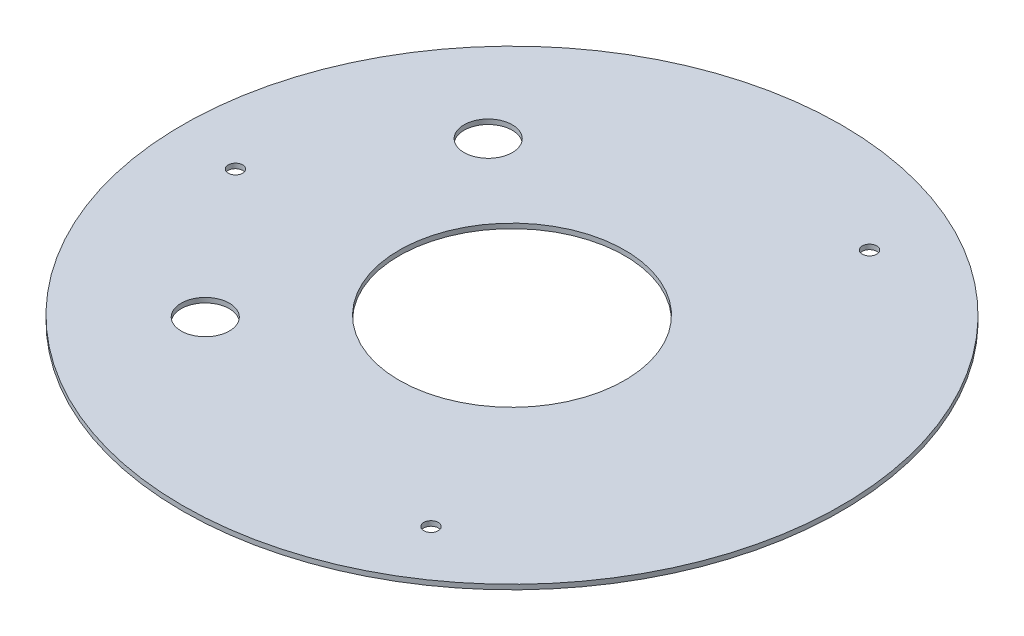
ISO-10303-21;
HEADER;
FILE_DESCRIPTION(('STEP AP214'),'2;1');
FILE_NAME('part.step','',(''),(''),'','','');
FILE_SCHEMA(('AUTOMOTIVE_DESIGN { 1 0 10303 214 1 1 1 1 }'));
ENDSEC;
DATA;
#1=APPLICATION_CONTEXT('core data for automotive mechanical design processes');
#2=APPLICATION_PROTOCOL_DEFINITION('international standard','automotive_design',2000,#1);
#3=PRODUCT_CONTEXT('',#1,'mechanical');
#4=PRODUCT('Part','Part','',(#3));
#5=PRODUCT_RELATED_PRODUCT_CATEGORY('part','',(#4));
#6=PRODUCT_DEFINITION_FORMATION('','',#4);
#7=PRODUCT_DEFINITION_CONTEXT('part definition',#1,'design');
#8=PRODUCT_DEFINITION('design','',#6,#7);
#9=PRODUCT_DEFINITION_SHAPE('','',#8);
#10=(LENGTH_UNIT() NAMED_UNIT(*) SI_UNIT(.MILLI.,.METRE.));
#11=(NAMED_UNIT(*) PLANE_ANGLE_UNIT() SI_UNIT($,.RADIAN.));
#12=(NAMED_UNIT(*) SI_UNIT($,.STERADIAN.) SOLID_ANGLE_UNIT());
#13=UNCERTAINTY_MEASURE_WITH_UNIT(LENGTH_MEASURE(1.E-05),#10,'distance_accuracy_value','');
#14=(GEOMETRIC_REPRESENTATION_CONTEXT(3) GLOBAL_UNCERTAINTY_ASSIGNED_CONTEXT((#13)) GLOBAL_UNIT_ASSIGNED_CONTEXT((#10,
#11,#12)) REPRESENTATION_CONTEXT('',''));
#15=CARTESIAN_POINT('',(0.,0.,0.));
#16=DIRECTION('',(0.,0.,1.));
#17=DIRECTION('',(1.,0.,0.));
#18=AXIS2_PLACEMENT_3D('',#15,#16,#17);
#19=CARTESIAN_POINT('',(73.2496011945377,1.,33.2166503223373));
#20=DIRECTION('',(0.,1.,0.));
#21=DIRECTION('',(0.,0.,1.));
#22=AXIS2_PLACEMENT_3D('',#19,#20,#21);
#23=PLANE('',#22);
#24=CARTESIAN_POINT('',(41.7658419540778,1.,65.3689893366105));
#25=DIRECTION('',(0.,1.,0.));
#26=DIRECTION('',(0.,0.,1.));
#27=AXIS2_PLACEMENT_3D('',#24,#25,#26);
#28=CIRCLE('',#27,5.);
#29=CARTESIAN_POINT('',(41.7658419540778,1.,70.3689893366105));
#30=VERTEX_POINT('',#29);
#31=EDGE_CURVE('E66',#30,#30,#28,.T.);
#32=ORIENTED_EDGE('',*,*,#31,.F.);
#33=EDGE_LOOP('',(#32));
#34=FACE_BOUND('',#33,.T.);
#35=CARTESIAN_POINT('',(39.056391221283,1.,3.96217388325344));
#36=DIRECTION('',(0.,1.,0.));
#37=DIRECTION('',(0.,0.,1.));
#38=AXIS2_PLACEMENT_3D('',#35,#36,#37);
#39=CIRCLE('',#38,5.);
#40=CARTESIAN_POINT('',(39.056391221283,1.,8.96217388325344));
#41=VERTEX_POINT('',#40);
#42=EDGE_CURVE('E65',#41,#41,#39,.T.);
#43=ORIENTED_EDGE('',*,*,#42,.F.);
#44=EDGE_LOOP('',(#43));
#45=FACE_BOUND('',#44,.T.);
#46=CARTESIAN_POINT('',(102.822466875922,1.,79.5895477451951));
#47=DIRECTION('',(0.,-1.,0.));
#48=DIRECTION('',(0.,0.,-1.));
#49=AXIS2_PLACEMENT_3D('',#46,#47,#48);
#50=CIRCLE('',#49,1.50000000000001);
#51=CARTESIAN_POINT('',(102.822466875922,1.,78.0895477451951));
#52=VERTEX_POINT('',#51);
#53=EDGE_CURVE('E59',#52,#52,#50,.T.);
#54=ORIENTED_EDGE('',*,*,#53,.T.);
#55=EDGE_LOOP('',(#54));
#56=FACE_BOUND('',#55,.T.);
#57=CARTESIAN_POINT('',(73.2496011945377,1.,33.2166503223373));
#58=DIRECTION('',(0.,1.,0.));
#59=DIRECTION('',(0.,0.,1.));
#60=AXIS2_PLACEMENT_3D('',#57,#58,#59);
#61=CIRCLE('',#60,23.4009999999999);
#62=CARTESIAN_POINT('',(73.2496011945377,1.,56.6176503223373));
#63=VERTEX_POINT('',#62);
#64=EDGE_CURVE('E46',#63,#63,#61,.T.);
#65=ORIENTED_EDGE('',*,*,#64,.F.);
#66=EDGE_LOOP('',(#65));
#67=FACE_BOUND('',#66,.T.);
#68=CARTESIAN_POINT('',(73.2496011945377,1.,33.2166503223373));
#69=DIRECTION('',(0.,1.,0.));
#70=DIRECTION('',(0.,0.,1.));
#71=AXIS2_PLACEMENT_3D('',#68,#69,#70);
#72=CIRCLE('',#71,68.3699999983781);
#73=CARTESIAN_POINT('',(73.2496011945377,1.,101.586650320715));
#74=VERTEX_POINT('',#73);
#75=EDGE_CURVE('E10',#74,#74,#72,.T.);
#76=ORIENTED_EDGE('',*,*,#75,.T.);
#77=EDGE_LOOP('',(#76));
#78=FACE_BOUND('',#77,.T.);
#79=CARTESIAN_POINT('',(18.3030611385606,1.,35.6410545536932));
#80=DIRECTION('',(0.,-1.,0.));
#81=DIRECTION('',(0.,0.,-1.));
#82=AXIS2_PLACEMENT_3D('',#79,#80,#81);
#83=CIRCLE('',#82,1.50000000000001);
#84=CARTESIAN_POINT('',(18.3030611385606,1.,34.1410545536932));
#85=VERTEX_POINT('',#84);
#86=EDGE_CURVE('E55',#85,#85,#83,.T.);
#87=ORIENTED_EDGE('',*,*,#86,.T.);
#88=EDGE_LOOP('',(#87));
#89=FACE_BOUND('',#88,.T.);
#90=CARTESIAN_POINT('',(98.6232755691298,1.,-15.5806513318759));
#91=DIRECTION('',(0.,-1.,0.));
#92=DIRECTION('',(0.,0.,-1.));
#93=AXIS2_PLACEMENT_3D('',#90,#91,#92);
#94=CIRCLE('',#93,1.5);
#95=CARTESIAN_POINT('',(98.6232755691298,1.,-17.0806513318759));
#96=VERTEX_POINT('',#95);
#97=EDGE_CURVE('E62',#96,#96,#94,.T.);
#98=ORIENTED_EDGE('',*,*,#97,.T.);
#99=EDGE_LOOP('',(#98));
#100=FACE_BOUND('',#99,.T.);
#101=ADVANCED_FACE('F33',(#34,#45,#56,#67,#78,#89,#100),#23,.T.);
#102=CARTESIAN_POINT('',(73.2496011945377,0.,33.2166503223373));
#103=DIRECTION('',(0.,1.,0.));
#104=DIRECTION('',(0.,0.,1.));
#105=AXIS2_PLACEMENT_3D('',#102,#103,#104);
#106=PLANE('',#105);
#107=CARTESIAN_POINT('',(41.7658419540778,0.,65.3689893366105));
#108=DIRECTION('',(0.,1.,0.));
#109=DIRECTION('',(0.,0.,1.));
#110=AXIS2_PLACEMENT_3D('',#107,#108,#109);
#111=CIRCLE('',#110,5.);
#112=CARTESIAN_POINT('',(41.7658419540778,0.,70.3689893366105));
#113=VERTEX_POINT('',#112);
#114=EDGE_CURVE('E37',#113,#113,#111,.T.);
#115=ORIENTED_EDGE('',*,*,#114,.T.);
#116=EDGE_LOOP('',(#115));
#117=FACE_BOUND('',#116,.T.);
#118=CARTESIAN_POINT('',(39.056391221283,0.,3.96217388325344));
#119=DIRECTION('',(0.,1.,0.));
#120=DIRECTION('',(0.,0.,1.));
#121=AXIS2_PLACEMENT_3D('',#118,#119,#120);
#122=CIRCLE('',#121,5.);
#123=CARTESIAN_POINT('',(39.056391221283,0.,8.96217388325344));
#124=VERTEX_POINT('',#123);
#125=EDGE_CURVE('E63',#124,#124,#122,.T.);
#126=ORIENTED_EDGE('',*,*,#125,.T.);
#127=EDGE_LOOP('',(#126));
#128=FACE_BOUND('',#127,.T.);
#129=CARTESIAN_POINT('',(102.822466875922,0.,79.5895477451951));
#130=DIRECTION('',(0.,1.,0.));
#131=DIRECTION('',(0.,0.,1.));
#132=AXIS2_PLACEMENT_3D('',#129,#130,#131);
#133=CIRCLE('',#132,1.50000000000001);
#134=CARTESIAN_POINT('',(102.822466875922,0.,81.0895477451951));
#135=VERTEX_POINT('',#134);
#136=EDGE_CURVE('E56',#135,#135,#133,.F.);
#137=ORIENTED_EDGE('',*,*,#136,.F.);
#138=EDGE_LOOP('',(#137));
#139=FACE_BOUND('',#138,.T.);
#140=CARTESIAN_POINT('',(73.2496011945377,0.,33.2166503223373));
#141=DIRECTION('',(0.,1.,0.));
#142=DIRECTION('',(0.,0.,1.));
#143=AXIS2_PLACEMENT_3D('',#140,#141,#142);
#144=CIRCLE('',#143,23.4009999999999);
#145=CARTESIAN_POINT('',(73.2496011945377,0.,56.6176503223373));
#146=VERTEX_POINT('',#145);
#147=EDGE_CURVE('E49',#146,#146,#144,.T.);
#148=ORIENTED_EDGE('',*,*,#147,.T.);
#149=EDGE_LOOP('',(#148));
#150=FACE_BOUND('',#149,.T.);
#151=CARTESIAN_POINT('',(73.2496011945377,0.,33.2166503223373));
#152=DIRECTION('',(0.,1.,0.));
#153=DIRECTION('',(0.,0.,1.));
#154=AXIS2_PLACEMENT_3D('',#151,#152,#153);
#155=CIRCLE('',#154,68.3699999983781);
#156=CARTESIAN_POINT('',(73.2496011945377,0.,101.586650320715));
#157=VERTEX_POINT('',#156);
#158=EDGE_CURVE('E41',#157,#157,#155,.T.);
#159=ORIENTED_EDGE('',*,*,#158,.F.);
#160=EDGE_LOOP('',(#159));
#161=FACE_BOUND('',#160,.T.);
#162=CARTESIAN_POINT('',(18.3030611385606,0.,35.6410545536932));
#163=DIRECTION('',(0.,1.,0.));
#164=DIRECTION('',(0.,0.,1.));
#165=AXIS2_PLACEMENT_3D('',#162,#163,#164);
#166=CIRCLE('',#165,1.50000000000001);
#167=CARTESIAN_POINT('',(18.3030611385606,0.,37.1410545536932));
#168=VERTEX_POINT('',#167);
#169=EDGE_CURVE('E52',#168,#168,#166,.F.);
#170=ORIENTED_EDGE('',*,*,#169,.F.);
#171=EDGE_LOOP('',(#170));
#172=FACE_BOUND('',#171,.T.);
#173=CARTESIAN_POINT('',(98.6232755691298,0.,-15.5806513318759));
#174=DIRECTION('',(0.,1.,0.));
#175=DIRECTION('',(0.,0.,1.));
#176=AXIS2_PLACEMENT_3D('',#173,#174,#175);
#177=CIRCLE('',#176,1.5);
#178=CARTESIAN_POINT('',(98.6232755691298,0.,-14.0806513318759));
#179=VERTEX_POINT('',#178);
#180=EDGE_CURVE('E60',#179,#179,#177,.F.);
#181=ORIENTED_EDGE('',*,*,#180,.F.);
#182=EDGE_LOOP('',(#181));
#183=FACE_BOUND('',#182,.T.);
#184=ADVANCED_FACE('F88',(#117,#128,#139,#150,#161,#172,#183),#106,.F.);
#185=CARTESIAN_POINT('',(73.2496011945377,1.,33.2166503223373));
#186=DIRECTION('',(0.,-1.,0.));
#187=DIRECTION('',(0.,0.,-1.));
#188=AXIS2_PLACEMENT_3D('',#185,#186,#187);
#189=CYLINDRICAL_SURFACE('',#188,68.3699999983781);
#190=ORIENTED_EDGE('',*,*,#75,.F.);
#191=EDGE_LOOP('',(#190));
#192=FACE_BOUND('',#191,.T.);
#193=ORIENTED_EDGE('',*,*,#158,.T.);
#194=EDGE_LOOP('',(#193));
#195=FACE_BOUND('',#194,.T.);
#196=ADVANCED_FACE('F35',(#192,#195),#189,.T.);
#197=CARTESIAN_POINT('',(73.2496011945377,1.,33.2166503223373));
#198=DIRECTION('',(0.,-1.,0.));
#199=DIRECTION('',(0.,0.,-1.));
#200=AXIS2_PLACEMENT_3D('',#197,#198,#199);
#201=CYLINDRICAL_SURFACE('',#200,23.4009999999999);
#202=ORIENTED_EDGE('',*,*,#64,.T.);
#203=EDGE_LOOP('',(#202));
#204=FACE_BOUND('',#203,.T.);
#205=ORIENTED_EDGE('',*,*,#147,.F.);
#206=EDGE_LOOP('',(#205));
#207=FACE_BOUND('',#206,.T.);
#208=ADVANCED_FACE('F91',(#204,#207),#201,.F.);
#209=CARTESIAN_POINT('',(18.3030611385606,-9.,35.6410545536932));
#210=DIRECTION('',(0.,1.,0.));
#211=DIRECTION('',(0.,0.,1.));
#212=AXIS2_PLACEMENT_3D('',#209,#210,#211);
#213=CYLINDRICAL_SURFACE('',#212,1.50000000000001);
#214=ORIENTED_EDGE('',*,*,#86,.F.);
#215=EDGE_LOOP('',(#214));
#216=FACE_BOUND('',#215,.T.);
#217=ORIENTED_EDGE('',*,*,#169,.T.);
#218=EDGE_LOOP('',(#217));
#219=FACE_BOUND('',#218,.T.);
#220=ADVANCED_FACE('F93',(#216,#219),#213,.F.);
#221=CARTESIAN_POINT('',(102.822466875922,-9.,79.5895477451951));
#222=DIRECTION('',(0.,1.,0.));
#223=DIRECTION('',(0.,0.,1.));
#224=AXIS2_PLACEMENT_3D('',#221,#222,#223);
#225=CYLINDRICAL_SURFACE('',#224,1.50000000000001);
#226=ORIENTED_EDGE('',*,*,#53,.F.);
#227=EDGE_LOOP('',(#226));
#228=FACE_BOUND('',#227,.T.);
#229=ORIENTED_EDGE('',*,*,#136,.T.);
#230=EDGE_LOOP('',(#229));
#231=FACE_BOUND('',#230,.T.);
#232=ADVANCED_FACE('F99',(#228,#231),#225,.F.);
#233=CARTESIAN_POINT('',(98.6232755691298,-9.,-15.5806513318759));
#234=DIRECTION('',(0.,1.,0.));
#235=DIRECTION('',(0.,0.,1.));
#236=AXIS2_PLACEMENT_3D('',#233,#234,#235);
#237=CYLINDRICAL_SURFACE('',#236,1.5);
#238=ORIENTED_EDGE('',*,*,#97,.F.);
#239=EDGE_LOOP('',(#238));
#240=FACE_BOUND('',#239,.T.);
#241=ORIENTED_EDGE('',*,*,#180,.T.);
#242=EDGE_LOOP('',(#241));
#243=FACE_BOUND('',#242,.T.);
#244=ADVANCED_FACE('F120',(#240,#243),#237,.F.);
#245=CARTESIAN_POINT('',(39.056391221283,8.,3.96217388325344));
#246=DIRECTION('',(0.,-1.,0.));
#247=DIRECTION('',(0.,0.,-1.));
#248=AXIS2_PLACEMENT_3D('',#245,#246,#247);
#249=CYLINDRICAL_SURFACE('',#248,5.);
#250=ORIENTED_EDGE('',*,*,#42,.T.);
#251=EDGE_LOOP('',(#250));
#252=FACE_BOUND('',#251,.T.);
#253=ORIENTED_EDGE('',*,*,#125,.F.);
#254=EDGE_LOOP('',(#253));
#255=FACE_BOUND('',#254,.T.);
#256=ADVANCED_FACE('F123',(#252,#255),#249,.F.);
#257=CARTESIAN_POINT('',(41.7658419540778,8.,65.3689893366105));
#258=DIRECTION('',(0.,-1.,0.));
#259=DIRECTION('',(0.,0.,-1.));
#260=AXIS2_PLACEMENT_3D('',#257,#258,#259);
#261=CYLINDRICAL_SURFACE('',#260,5.);
#262=ORIENTED_EDGE('',*,*,#31,.T.);
#263=EDGE_LOOP('',(#262));
#264=FACE_BOUND('',#263,.T.);
#265=ORIENTED_EDGE('',*,*,#114,.F.);
#266=EDGE_LOOP('',(#265));
#267=FACE_BOUND('',#266,.T.);
#268=ADVANCED_FACE('F131',(#264,#267),#261,.F.);
#269=CLOSED_SHELL('',(#101,#184,#196,#208,#220,#232,#244,#256,#268));
#270=MANIFOLD_SOLID_BREP('B2',#269);
#271=ADVANCED_BREP_SHAPE_REPRESENTATION('',(#18,#270),#14);
#272=SHAPE_DEFINITION_REPRESENTATION(#9,#271);
ENDSEC;
END-ISO-10303-21;
